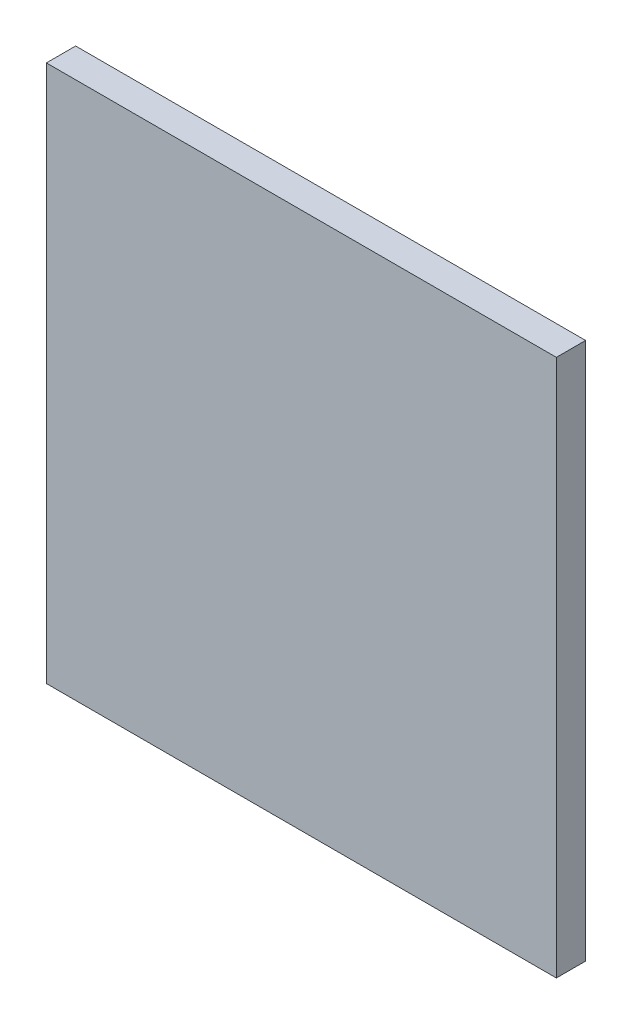
ISO-10303-21;
HEADER;
FILE_DESCRIPTION(('STEP AP214'),'2;1');
FILE_NAME('part.step','',(''),(''),'','','');
FILE_SCHEMA(('AUTOMOTIVE_DESIGN { 1 0 10303 214 1 1 1 1 }'));
ENDSEC;
DATA;
#1=APPLICATION_CONTEXT('core data for automotive mechanical design processes');
#2=APPLICATION_PROTOCOL_DEFINITION('international standard','automotive_design',2000,#1);
#3=PRODUCT_CONTEXT('',#1,'mechanical');
#4=PRODUCT('Part','Part','',(#3));
#5=PRODUCT_RELATED_PRODUCT_CATEGORY('part','',(#4));
#6=PRODUCT_DEFINITION_FORMATION('','',#4);
#7=PRODUCT_DEFINITION_CONTEXT('part definition',#1,'design');
#8=PRODUCT_DEFINITION('design','',#6,#7);
#9=PRODUCT_DEFINITION_SHAPE('','',#8);
#10=(LENGTH_UNIT() NAMED_UNIT(*) SI_UNIT(.MILLI.,.METRE.));
#11=(NAMED_UNIT(*) PLANE_ANGLE_UNIT() SI_UNIT($,.RADIAN.));
#12=(NAMED_UNIT(*) SI_UNIT($,.STERADIAN.) SOLID_ANGLE_UNIT());
#13=UNCERTAINTY_MEASURE_WITH_UNIT(LENGTH_MEASURE(1.E-05),#10,'distance_accuracy_value','');
#14=(GEOMETRIC_REPRESENTATION_CONTEXT(3) GLOBAL_UNCERTAINTY_ASSIGNED_CONTEXT((#13)) GLOBAL_UNIT_ASSIGNED_CONTEXT((#10,
#11,#12)) REPRESENTATION_CONTEXT('',''));
#15=CARTESIAN_POINT('',(0.,0.,0.));
#16=DIRECTION('',(0.,0.,1.));
#17=DIRECTION('',(1.,0.,0.));
#18=AXIS2_PLACEMENT_3D('',#15,#16,#17);
#19=CARTESIAN_POINT('',(-77.2394909773887,-17.5933201300239,19.05));
#20=DIRECTION('',(1.,0.,0.));
#21=DIRECTION('',(0.,1.,0.));
#22=AXIS2_PLACEMENT_3D('',#19,#20,#21);
#23=PLANE('',#22);
#24=DIRECTION('',(0.,-1.,0.));
#25=VECTOR('',#24,1.);
#26=CARTESIAN_POINT('',(-77.2394909773887,-17.5933201300239,0.));
#27=LINE('',#26,#25);
#28=CARTESIAN_POINT('',(-77.2394909773887,-17.5933201300239,0.));
#29=VERTEX_POINT('',#28);
#30=CARTESIAN_POINT('',(-77.2394909773887,-367.593320130024,0.));
#31=VERTEX_POINT('',#30);
#32=EDGE_CURVE('E102',#29,#31,#27,.T.);
#33=ORIENTED_EDGE('',*,*,#32,.T.);
#34=DIRECTION('',(0.,0.,-1.));
#35=VECTOR('',#34,1.);
#36=CARTESIAN_POINT('',(-77.2394909773887,-367.593320130024,19.05));
#37=LINE('',#36,#35);
#38=CARTESIAN_POINT('',(-77.2394909773887,-367.593320130024,19.05));
#39=VERTEX_POINT('',#38);
#40=EDGE_CURVE('E11',#39,#31,#37,.T.);
#41=ORIENTED_EDGE('',*,*,#40,.F.);
#42=DIRECTION('',(0.,-1.,0.));
#43=VECTOR('',#42,1.);
#44=CARTESIAN_POINT('',(-77.2394909773887,-17.5933201300239,19.05));
#45=LINE('',#44,#43);
#46=CARTESIAN_POINT('',(-77.2394909773887,-17.5933201300239,19.05));
#47=VERTEX_POINT('',#46);
#48=EDGE_CURVE('E95',#47,#39,#45,.T.);
#49=ORIENTED_EDGE('',*,*,#48,.F.);
#50=DIRECTION('',(0.,0.,-1.));
#51=VECTOR('',#50,1.);
#52=CARTESIAN_POINT('',(-77.2394909773887,-17.5933201300239,19.05));
#53=LINE('',#52,#51);
#54=EDGE_CURVE('E99',#47,#29,#53,.T.);
#55=ORIENTED_EDGE('',*,*,#54,.T.);
#56=EDGE_LOOP('',(#33,#41,#49,#55));
#57=FACE_BOUND('',#56,.T.);
#58=ADVANCED_FACE('F41',(#57),#23,.F.);
#59=CARTESIAN_POINT('',(-77.2394909773887,-367.593320130024,19.05));
#60=DIRECTION('',(0.,1.,0.));
#61=DIRECTION('',(0.,0.,1.));
#62=AXIS2_PLACEMENT_3D('',#59,#60,#61);
#63=PLANE('',#62);
#64=DIRECTION('',(1.,0.,0.));
#65=VECTOR('',#64,1.);
#66=CARTESIAN_POINT('',(-77.2394909773887,-367.593320130024,0.));
#67=LINE('',#66,#65);
#68=CARTESIAN_POINT('',(254.830404689763,-367.593320130024,0.));
#69=VERTEX_POINT('',#68);
#70=EDGE_CURVE('E96',#31,#69,#67,.T.);
#71=ORIENTED_EDGE('',*,*,#70,.T.);
#72=DIRECTION('',(0.,0.,-1.));
#73=VECTOR('',#72,1.);
#74=CARTESIAN_POINT('',(254.830404689763,-367.593320130024,19.05));
#75=LINE('',#74,#73);
#76=CARTESIAN_POINT('',(254.830404689763,-367.593320130024,19.05));
#77=VERTEX_POINT('',#76);
#78=EDGE_CURVE('E47',#77,#69,#75,.T.);
#79=ORIENTED_EDGE('',*,*,#78,.F.);
#80=DIRECTION('',(1.,0.,0.));
#81=VECTOR('',#80,1.);
#82=CARTESIAN_POINT('',(-77.2394909773887,-367.593320130024,19.05));
#83=LINE('',#82,#81);
#84=EDGE_CURVE('E87',#39,#77,#83,.T.);
#85=ORIENTED_EDGE('',*,*,#84,.F.);
#86=ORIENTED_EDGE('',*,*,#40,.T.);
#87=EDGE_LOOP('',(#71,#79,#85,#86));
#88=FACE_BOUND('',#87,.T.);
#89=ADVANCED_FACE('F92',(#88),#63,.F.);
#90=CARTESIAN_POINT('',(254.830404689763,-17.5933201300239,19.05));
#91=DIRECTION('',(-1.,0.,0.));
#92=DIRECTION('',(0.,0.,1.));
#93=AXIS2_PLACEMENT_3D('',#90,#91,#92);
#94=PLANE('',#93);
#95=DIRECTION('',(0.,1.,0.));
#96=VECTOR('',#95,1.);
#97=CARTESIAN_POINT('',(254.830404689763,-17.5933201300239,0.));
#98=LINE('',#97,#96);
#99=CARTESIAN_POINT('',(254.830404689763,-17.5933201300239,0.));
#100=VERTEX_POINT('',#99);
#101=EDGE_CURVE('E74',#69,#100,#98,.T.);
#102=ORIENTED_EDGE('',*,*,#101,.T.);
#103=DIRECTION('',(0.,0.,-1.));
#104=VECTOR('',#103,1.);
#105=CARTESIAN_POINT('',(254.830404689763,-17.5933201300239,19.05));
#106=LINE('',#105,#104);
#107=CARTESIAN_POINT('',(254.830404689763,-17.5933201300239,19.05));
#108=VERTEX_POINT('',#107);
#109=EDGE_CURVE('E100',#108,#100,#106,.T.);
#110=ORIENTED_EDGE('',*,*,#109,.F.);
#111=DIRECTION('',(0.,1.,0.));
#112=VECTOR('',#111,1.);
#113=CARTESIAN_POINT('',(254.830404689763,-17.5933201300239,19.05));
#114=LINE('',#113,#112);
#115=EDGE_CURVE('E89',#77,#108,#114,.T.);
#116=ORIENTED_EDGE('',*,*,#115,.F.);
#117=ORIENTED_EDGE('',*,*,#78,.T.);
#118=EDGE_LOOP('',(#102,#110,#116,#117));
#119=FACE_BOUND('',#118,.T.);
#120=ADVANCED_FACE('F98',(#119),#94,.F.);
#121=CARTESIAN_POINT('',(-77.2394909773887,-17.5933201300239,19.05));
#122=DIRECTION('',(0.,-1.,0.));
#123=DIRECTION('',(0.,0.,-1.));
#124=AXIS2_PLACEMENT_3D('',#121,#122,#123);
#125=PLANE('',#124);
#126=DIRECTION('',(-1.,0.,0.));
#127=VECTOR('',#126,1.);
#128=CARTESIAN_POINT('',(-77.2394909773887,-17.5933201300239,0.));
#129=LINE('',#128,#127);
#130=EDGE_CURVE('E77',#100,#29,#129,.T.);
#131=ORIENTED_EDGE('',*,*,#130,.T.);
#132=ORIENTED_EDGE('',*,*,#54,.F.);
#133=DIRECTION('',(-1.,0.,0.));
#134=VECTOR('',#133,1.);
#135=CARTESIAN_POINT('',(-77.2394909773887,-17.5933201300239,19.05));
#136=LINE('',#135,#134);
#137=EDGE_CURVE('E60',#108,#47,#136,.T.);
#138=ORIENTED_EDGE('',*,*,#137,.F.);
#139=ORIENTED_EDGE('',*,*,#109,.T.);
#140=EDGE_LOOP('',(#131,#132,#138,#139));
#141=FACE_BOUND('',#140,.T.);
#142=ADVANCED_FACE('F112',(#141),#125,.F.);
#143=CARTESIAN_POINT('',(0.,0.,19.05));
#144=DIRECTION('',(0.,0.,1.));
#145=DIRECTION('',(1.,0.,0.));
#146=AXIS2_PLACEMENT_3D('',#143,#144,#145);
#147=PLANE('',#146);
#148=ORIENTED_EDGE('',*,*,#48,.T.);
#149=ORIENTED_EDGE('',*,*,#84,.T.);
#150=ORIENTED_EDGE('',*,*,#115,.T.);
#151=ORIENTED_EDGE('',*,*,#137,.T.);
#152=EDGE_LOOP('',(#148,#149,#150,#151));
#153=FACE_BOUND('',#152,.T.);
#154=ADVANCED_FACE('F86',(#153),#147,.T.);
#155=CARTESIAN_POINT('',(0.,0.,0.));
#156=DIRECTION('',(0.,0.,1.));
#157=DIRECTION('',(1.,0.,0.));
#158=AXIS2_PLACEMENT_3D('',#155,#156,#157);
#159=PLANE('',#158);
#160=ORIENTED_EDGE('',*,*,#32,.F.);
#161=ORIENTED_EDGE('',*,*,#130,.F.);
#162=ORIENTED_EDGE('',*,*,#101,.F.);
#163=ORIENTED_EDGE('',*,*,#70,.F.);
#164=EDGE_LOOP('',(#160,#161,#162,#163));
#165=FACE_BOUND('',#164,.T.);
#166=ADVANCED_FACE('F111',(#165),#159,.F.);
#167=CLOSED_SHELL('',(#58,#89,#120,#142,#154,#166));
#168=MANIFOLD_SOLID_BREP('B2',#167);
#169=ADVANCED_BREP_SHAPE_REPRESENTATION('',(#18,#168),#14);
#170=SHAPE_DEFINITION_REPRESENTATION(#9,#169);
ENDSEC;
END-ISO-10303-21;
